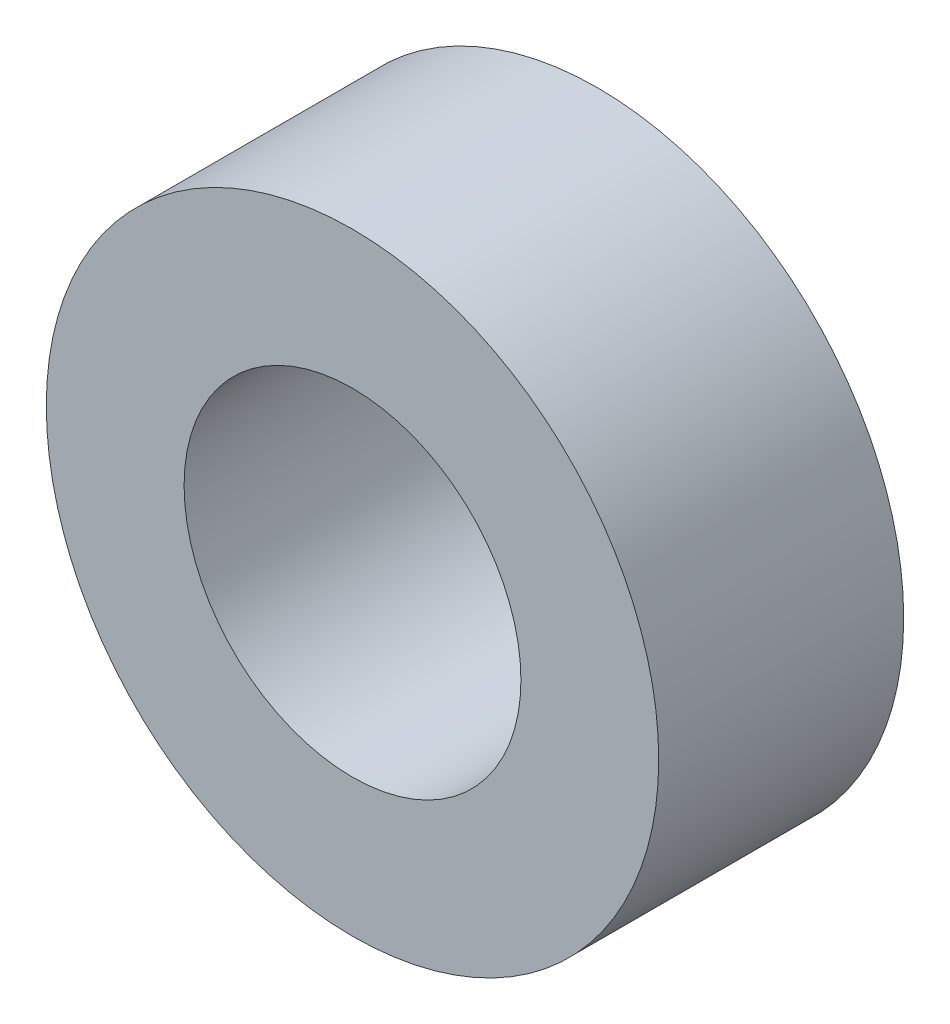
ISO-10303-21;
HEADER;
FILE_DESCRIPTION(('STEP AP214'),'2;1');
FILE_NAME('part.step','',(''),(''),'','','');
FILE_SCHEMA(('AUTOMOTIVE_DESIGN { 1 0 10303 214 1 1 1 1 }'));
ENDSEC;
DATA;
#1=APPLICATION_CONTEXT('core data for automotive mechanical design processes');
#2=APPLICATION_PROTOCOL_DEFINITION('international standard','automotive_design',2000,#1);
#3=PRODUCT_CONTEXT('',#1,'mechanical');
#4=PRODUCT('Part','Part','',(#3));
#5=PRODUCT_RELATED_PRODUCT_CATEGORY('part','',(#4));
#6=PRODUCT_DEFINITION_FORMATION('','',#4);
#7=PRODUCT_DEFINITION_CONTEXT('part definition',#1,'design');
#8=PRODUCT_DEFINITION('design','',#6,#7);
#9=PRODUCT_DEFINITION_SHAPE('','',#8);
#10=(LENGTH_UNIT() NAMED_UNIT(*) SI_UNIT(.MILLI.,.METRE.));
#11=(NAMED_UNIT(*) PLANE_ANGLE_UNIT() SI_UNIT($,.RADIAN.));
#12=(NAMED_UNIT(*) SI_UNIT($,.STERADIAN.) SOLID_ANGLE_UNIT());
#13=UNCERTAINTY_MEASURE_WITH_UNIT(LENGTH_MEASURE(1.E-05),#10,'distance_accuracy_value','');
#14=(GEOMETRIC_REPRESENTATION_CONTEXT(3) GLOBAL_UNCERTAINTY_ASSIGNED_CONTEXT((#13)) GLOBAL_UNIT_ASSIGNED_CONTEXT((#10,
#11,#12)) REPRESENTATION_CONTEXT('',''));
#15=CARTESIAN_POINT('',(0.,0.,0.));
#16=DIRECTION('',(0.,0.,1.));
#17=DIRECTION('',(1.,0.,0.));
#18=AXIS2_PLACEMENT_3D('',#15,#16,#17);
#19=CARTESIAN_POINT('',(0.,0.,4.));
#20=DIRECTION('',(0.,0.,1.));
#21=DIRECTION('',(1.,0.,0.));
#22=AXIS2_PLACEMENT_3D('',#19,#20,#21);
#23=PLANE('',#22);
#24=CARTESIAN_POINT('',(0.,0.,4.));
#25=DIRECTION('',(0.,0.,1.));
#26=DIRECTION('',(1.,0.,0.));
#27=AXIS2_PLACEMENT_3D('',#24,#25,#26);
#28=CIRCLE('',#27,5.);
#29=CARTESIAN_POINT('',(5.,0.,4.));
#30=VERTEX_POINT('',#29);
#31=EDGE_CURVE('E10',#30,#30,#28,.T.);
#32=ORIENTED_EDGE('',*,*,#31,.T.);
#33=EDGE_LOOP('',(#32));
#34=FACE_BOUND('',#33,.T.);
#35=CARTESIAN_POINT('',(0.,0.,4.));
#36=DIRECTION('',(0.,0.,1.));
#37=DIRECTION('',(1.,0.,0.));
#38=AXIS2_PLACEMENT_3D('',#35,#36,#37);
#39=CIRCLE('',#38,2.75);
#40=CARTESIAN_POINT('',(2.75,0.,4.));
#41=VERTEX_POINT('',#40);
#42=EDGE_CURVE('E43',#41,#41,#39,.T.);
#43=ORIENTED_EDGE('',*,*,#42,.F.);
#44=EDGE_LOOP('',(#43));
#45=FACE_BOUND('',#44,.T.);
#46=ADVANCED_FACE('F32',(#34,#45),#23,.T.);
#47=CARTESIAN_POINT('',(0.,0.,0.));
#48=DIRECTION('',(0.,0.,1.));
#49=DIRECTION('',(1.,0.,0.));
#50=AXIS2_PLACEMENT_3D('',#47,#48,#49);
#51=PLANE('',#50);
#52=CARTESIAN_POINT('',(0.,0.,0.));
#53=DIRECTION('',(0.,0.,1.));
#54=DIRECTION('',(1.,0.,0.));
#55=AXIS2_PLACEMENT_3D('',#52,#53,#54);
#56=CIRCLE('',#55,5.);
#57=CARTESIAN_POINT('',(5.,0.,0.));
#58=VERTEX_POINT('',#57);
#59=EDGE_CURVE('E36',#58,#58,#56,.T.);
#60=ORIENTED_EDGE('',*,*,#59,.F.);
#61=EDGE_LOOP('',(#60));
#62=FACE_BOUND('',#61,.T.);
#63=CARTESIAN_POINT('',(0.,0.,0.));
#64=DIRECTION('',(0.,0.,1.));
#65=DIRECTION('',(1.,0.,0.));
#66=AXIS2_PLACEMENT_3D('',#63,#64,#65);
#67=CIRCLE('',#66,2.75);
#68=CARTESIAN_POINT('',(2.75,0.,0.));
#69=VERTEX_POINT('',#68);
#70=EDGE_CURVE('E45',#69,#69,#67,.T.);
#71=ORIENTED_EDGE('',*,*,#70,.T.);
#72=EDGE_LOOP('',(#71));
#73=FACE_BOUND('',#72,.T.);
#74=ADVANCED_FACE('F55',(#62,#73),#51,.F.);
#75=CARTESIAN_POINT('',(0.,0.,4.));
#76=DIRECTION('',(0.,0.,-1.));
#77=DIRECTION('',(-1.,0.,0.));
#78=AXIS2_PLACEMENT_3D('',#75,#76,#77);
#79=CYLINDRICAL_SURFACE('',#78,5.);
#80=ORIENTED_EDGE('',*,*,#31,.F.);
#81=EDGE_LOOP('',(#80));
#82=FACE_BOUND('',#81,.T.);
#83=ORIENTED_EDGE('',*,*,#59,.T.);
#84=EDGE_LOOP('',(#83));
#85=FACE_BOUND('',#84,.T.);
#86=ADVANCED_FACE('F34',(#82,#85),#79,.T.);
#87=CARTESIAN_POINT('',(0.,0.,4.));
#88=DIRECTION('',(0.,0.,-1.));
#89=DIRECTION('',(-1.,0.,0.));
#90=AXIS2_PLACEMENT_3D('',#87,#88,#89);
#91=CYLINDRICAL_SURFACE('',#90,2.75);
#92=ORIENTED_EDGE('',*,*,#42,.T.);
#93=EDGE_LOOP('',(#92));
#94=FACE_BOUND('',#93,.T.);
#95=ORIENTED_EDGE('',*,*,#70,.F.);
#96=EDGE_LOOP('',(#95));
#97=FACE_BOUND('',#96,.T.);
#98=ADVANCED_FACE('F51',(#94,#97),#91,.F.);
#99=CLOSED_SHELL('',(#46,#74,#86,#98));
#100=MANIFOLD_SOLID_BREP('B2',#99);
#101=ADVANCED_BREP_SHAPE_REPRESENTATION('',(#18,#100),#14);
#102=SHAPE_DEFINITION_REPRESENTATION(#9,#101);
ENDSEC;
END-ISO-10303-21;
